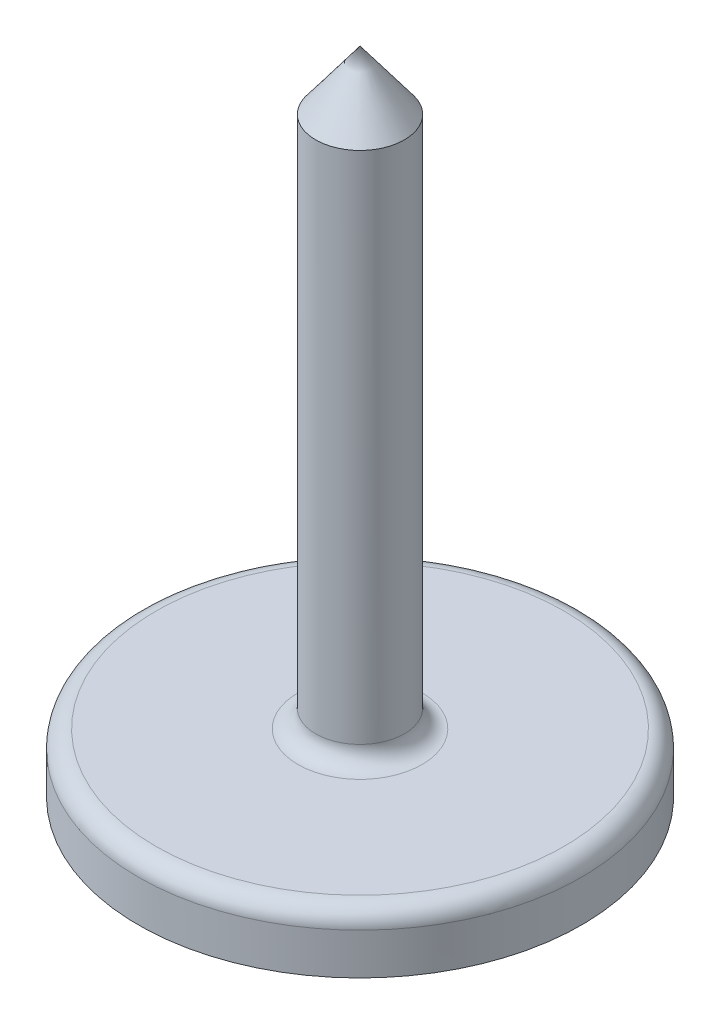
ISO-10303-21;
HEADER;
FILE_DESCRIPTION(('STEP AP214'),'2;1');
FILE_NAME('part.step','',(''),(''),'','','');
FILE_SCHEMA(('AUTOMOTIVE_DESIGN { 1 0 10303 214 1 1 1 1 }'));
ENDSEC;
DATA;
#1=APPLICATION_CONTEXT('core data for automotive mechanical design processes');
#2=APPLICATION_PROTOCOL_DEFINITION('international standard','automotive_design',2000,#1);
#3=PRODUCT_CONTEXT('',#1,'mechanical');
#4=PRODUCT('Part','Part','',(#3));
#5=PRODUCT_RELATED_PRODUCT_CATEGORY('part','',(#4));
#6=PRODUCT_DEFINITION_FORMATION('','',#4);
#7=PRODUCT_DEFINITION_CONTEXT('part definition',#1,'design');
#8=PRODUCT_DEFINITION('design','',#6,#7);
#9=PRODUCT_DEFINITION_SHAPE('','',#8);
#10=(LENGTH_UNIT() NAMED_UNIT(*) SI_UNIT(.MILLI.,.METRE.));
#11=(NAMED_UNIT(*) PLANE_ANGLE_UNIT() SI_UNIT($,.RADIAN.));
#12=(NAMED_UNIT(*) SI_UNIT($,.STERADIAN.) SOLID_ANGLE_UNIT());
#13=UNCERTAINTY_MEASURE_WITH_UNIT(LENGTH_MEASURE(1.E-05),#10,'distance_accuracy_value','');
#14=(GEOMETRIC_REPRESENTATION_CONTEXT(3) GLOBAL_UNCERTAINTY_ASSIGNED_CONTEXT((#13)) GLOBAL_UNIT_ASSIGNED_CONTEXT((#10,
#11,#12)) REPRESENTATION_CONTEXT('',''));
#15=CARTESIAN_POINT('',(0.,0.,0.));
#16=DIRECTION('',(0.,0.,1.));
#17=DIRECTION('',(1.,0.,0.));
#18=AXIS2_PLACEMENT_3D('',#15,#16,#17);
#19=CARTESIAN_POINT('',(0.,0.,0.));
#20=DIRECTION('',(0.,-1.,0.));
#21=DIRECTION('',(0.,0.,-1.));
#22=AXIS2_PLACEMENT_3D('',#19,#20,#21);
#23=PLANE('',#22);
#24=CARTESIAN_POINT('',(0.,0.,0.));
#25=DIRECTION('',(0.,-1.,0.));
#26=DIRECTION('',(0.,0.,-1.));
#27=AXIS2_PLACEMENT_3D('',#24,#25,#26);
#28=CIRCLE('',#27,37.5);
#29=CARTESIAN_POINT('',(0.,0.,-37.5));
#30=VERTEX_POINT('',#29);
#31=EDGE_CURVE('E61',#30,#30,#28,.T.);
#32=ORIENTED_EDGE('',*,*,#31,.T.);
#33=EDGE_LOOP('',(#32));
#34=FACE_BOUND('',#33,.T.);
#35=ADVANCED_FACE('F39',(#34),#23,.T.);
#36=CARTESIAN_POINT('',(0.,0.,0.));
#37=DIRECTION('',(0.,-1.,0.));
#38=DIRECTION('',(0.,0.,-1.));
#39=AXIS2_PLACEMENT_3D('',#36,#37,#38);
#40=CYLINDRICAL_SURFACE('',#39,37.5);
#41=CARTESIAN_POINT('',(0.,7.,0.));
#42=DIRECTION('',(0.,1.,0.));
#43=DIRECTION('',(0.,0.,1.));
#44=AXIS2_PLACEMENT_3D('',#41,#42,#43);
#45=CIRCLE('',#44,37.5);
#46=CARTESIAN_POINT('',(0.,7.,37.5));
#47=VERTEX_POINT('',#46);
#48=EDGE_CURVE('E11',#47,#47,#45,.F.);
#49=ORIENTED_EDGE('',*,*,#48,.T.);
#50=EDGE_LOOP('',(#49));
#51=FACE_BOUND('',#50,.T.);
#52=ORIENTED_EDGE('',*,*,#31,.F.);
#53=EDGE_LOOP('',(#52));
#54=FACE_BOUND('',#53,.T.);
#55=ADVANCED_FACE('F86',(#51,#54),#40,.T.);
#56=CARTESIAN_POINT('',(37.5,10.,0.));
#57=DIRECTION('',(0.,1.,0.));
#58=DIRECTION('',(0.,0.,1.));
#59=AXIS2_PLACEMENT_3D('',#56,#57,#58);
#60=PLANE('',#59);
#61=CARTESIAN_POINT('',(0.,10.,0.));
#62=DIRECTION('',(0.,1.,0.));
#63=DIRECTION('',(0.,0.,1.));
#64=AXIS2_PLACEMENT_3D('',#61,#62,#63);
#65=CIRCLE('',#64,10.5);
#66=CARTESIAN_POINT('',(0.,10.,10.5));
#67=VERTEX_POINT('',#66);
#68=EDGE_CURVE('E71',#67,#67,#65,.F.);
#69=ORIENTED_EDGE('',*,*,#68,.T.);
#70=EDGE_LOOP('',(#69));
#71=FACE_BOUND('',#70,.T.);
#72=CARTESIAN_POINT('',(0.,10.,0.));
#73=DIRECTION('',(0.,1.,0.));
#74=DIRECTION('',(0.,0.,1.));
#75=AXIS2_PLACEMENT_3D('',#72,#73,#74);
#76=CIRCLE('',#75,34.5);
#77=CARTESIAN_POINT('',(0.,10.,34.5));
#78=VERTEX_POINT('',#77);
#79=EDGE_CURVE('E65',#78,#78,#76,.T.);
#80=ORIENTED_EDGE('',*,*,#79,.T.);
#81=EDGE_LOOP('',(#80));
#82=FACE_BOUND('',#81,.T.);
#83=ADVANCED_FACE('F83',(#71,#82),#60,.T.);
#84=CARTESIAN_POINT('',(0.,0.,0.));
#85=DIRECTION('',(0.,-1.,0.));
#86=DIRECTION('',(0.,0.,-1.));
#87=AXIS2_PLACEMENT_3D('',#84,#85,#86);
#88=CYLINDRICAL_SURFACE('',#87,7.49999999999999);
#89=CARTESIAN_POINT('',(0.,13.,0.));
#90=DIRECTION('',(0.,1.,0.));
#91=DIRECTION('',(0.,0.,1.));
#92=AXIS2_PLACEMENT_3D('',#89,#90,#91);
#93=CIRCLE('',#92,7.49999999999999);
#94=CARTESIAN_POINT('',(0.,13.,7.49999999999999));
#95=VERTEX_POINT('',#94);
#96=EDGE_CURVE('E47',#95,#95,#93,.T.);
#97=ORIENTED_EDGE('',*,*,#96,.T.);
#98=EDGE_LOOP('',(#97));
#99=FACE_BOUND('',#98,.T.);
#100=CARTESIAN_POINT('',(0.,100.,0.));
#101=DIRECTION('',(0.,-1.,0.));
#102=DIRECTION('',(0.,0.,-1.));
#103=AXIS2_PLACEMENT_3D('',#100,#101,#102);
#104=CIRCLE('',#103,7.49999999999999);
#105=CARTESIAN_POINT('',(0.,100.,-7.49999999999999));
#106=VERTEX_POINT('',#105);
#107=EDGE_CURVE('E58',#106,#106,#104,.T.);
#108=ORIENTED_EDGE('',*,*,#107,.T.);
#109=EDGE_LOOP('',(#108));
#110=FACE_BOUND('',#109,.T.);
#111=ADVANCED_FACE('F54',(#99,#110),#88,.T.);
#112=CARTESIAN_POINT('',(0.,100.,0.));
#113=DIRECTION('',(0.,-1.,0.));
#114=DIRECTION('',(0.,0.,-1.));
#115=AXIS2_PLACEMENT_3D('',#112,#113,#114);
#116=CONICAL_SURFACE('',#115,7.49999999999999,0.643501108793283);
#117=CARTESIAN_POINT('',(0.,110.,0.));
#118=VERTEX_POINT('',#117);
#119=VERTEX_LOOP('',#118);
#120=FACE_BOUND('',#119,.T.);
#121=ORIENTED_EDGE('',*,*,#107,.F.);
#122=EDGE_LOOP('',(#121));
#123=FACE_BOUND('',#122,.T.);
#124=ADVANCED_FACE('F50',(#120,#123),#116,.T.);
#125=CARTESIAN_POINT('',(0.,13.,0.));
#126=DIRECTION('',(0.,1.,0.));
#127=DIRECTION('',(0.,0.,1.));
#128=AXIS2_PLACEMENT_3D('',#125,#126,#127);
#129=TOROIDAL_SURFACE('',#128,10.5,3.);
#130=ORIENTED_EDGE('',*,*,#96,.F.);
#131=EDGE_LOOP('',(#130));
#132=FACE_BOUND('',#131,.T.);
#133=ORIENTED_EDGE('',*,*,#68,.F.);
#134=EDGE_LOOP('',(#133));
#135=FACE_BOUND('',#134,.T.);
#136=ADVANCED_FACE('F53',(#132,#135),#129,.F.);
#137=CARTESIAN_POINT('',(0.,7.,0.));
#138=DIRECTION('',(0.,1.,0.));
#139=DIRECTION('',(0.,0.,1.));
#140=AXIS2_PLACEMENT_3D('',#137,#138,#139);
#141=TOROIDAL_SURFACE('',#140,34.5,3.);
#142=ORIENTED_EDGE('',*,*,#79,.F.);
#143=EDGE_LOOP('',(#142));
#144=FACE_BOUND('',#143,.T.);
#145=ORIENTED_EDGE('',*,*,#48,.F.);
#146=EDGE_LOOP('',(#145));
#147=FACE_BOUND('',#146,.T.);
#148=ADVANCED_FACE('F41',(#144,#147),#141,.T.);
#149=CLOSED_SHELL('',(#35,#55,#83,#111,#124,#136,#148));
#150=MANIFOLD_SOLID_BREP('B2',#149);
#151=ADVANCED_BREP_SHAPE_REPRESENTATION('',(#18,#150),#14);
#152=SHAPE_DEFINITION_REPRESENTATION(#9,#151);
ENDSEC;
END-ISO-10303-21;
